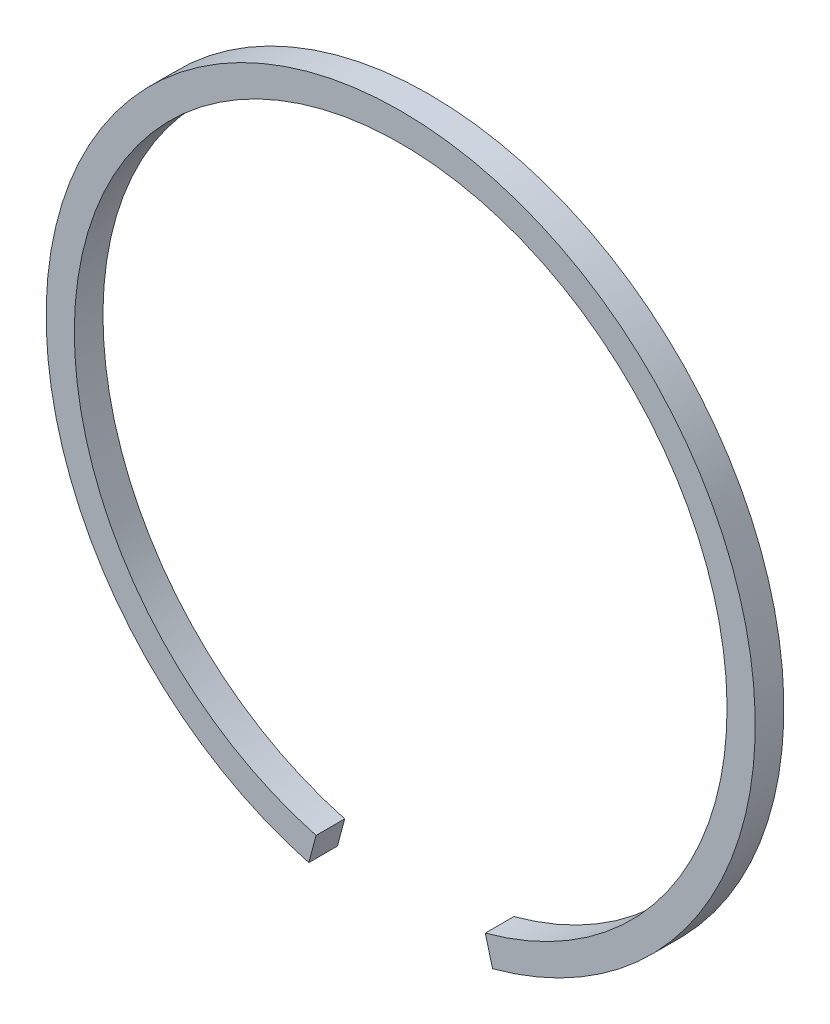
ISO-10303-21;
HEADER;
FILE_DESCRIPTION(('STEP AP214'),'2;1');
FILE_NAME('part.step','',(''),(''),'','','');
FILE_SCHEMA(('AUTOMOTIVE_DESIGN { 1 0 10303 214 1 1 1 1 }'));
ENDSEC;
DATA;
#1=APPLICATION_CONTEXT('core data for automotive mechanical design processes');
#2=APPLICATION_PROTOCOL_DEFINITION('international standard','automotive_design',2000,#1);
#3=PRODUCT_CONTEXT('',#1,'mechanical');
#4=PRODUCT('Part','Part','',(#3));
#5=PRODUCT_RELATED_PRODUCT_CATEGORY('part','',(#4));
#6=PRODUCT_DEFINITION_FORMATION('','',#4);
#7=PRODUCT_DEFINITION_CONTEXT('part definition',#1,'design');
#8=PRODUCT_DEFINITION('design','',#6,#7);
#9=PRODUCT_DEFINITION_SHAPE('','',#8);
#10=(LENGTH_UNIT() NAMED_UNIT(*) SI_UNIT(.MILLI.,.METRE.));
#11=(NAMED_UNIT(*) PLANE_ANGLE_UNIT() SI_UNIT($,.RADIAN.));
#12=(NAMED_UNIT(*) SI_UNIT($,.STERADIAN.) SOLID_ANGLE_UNIT());
#13=UNCERTAINTY_MEASURE_WITH_UNIT(LENGTH_MEASURE(1.E-05),#10,'distance_accuracy_value','');
#14=(GEOMETRIC_REPRESENTATION_CONTEXT(3) GLOBAL_UNCERTAINTY_ASSIGNED_CONTEXT((#13)) GLOBAL_UNIT_ASSIGNED_CONTEXT((#10,
#11,#12)) REPRESENTATION_CONTEXT('',''));
#15=CARTESIAN_POINT('',(0.,0.,0.));
#16=DIRECTION('',(0.,0.,1.));
#17=DIRECTION('',(1.,0.,0.));
#18=AXIS2_PLACEMENT_3D('',#15,#16,#17);
#19=CARTESIAN_POINT('',(0.,0.,0.));
#20=DIRECTION('',(0.,0.,-1.));
#21=DIRECTION('',(0.,-1.,0.));
#22=AXIS2_PLACEMENT_3D('',#19,#20,#21);
#23=PLANE('',#22);
#24=DIRECTION('',(-0.259179265658748,-0.965829233484156,0.));
#25=VECTOR('',#24,1.);
#26=CARTESIAN_POINT('',(-6.,-22.3589467551582,0.));
#27=LINE('',#26,#25);
#28=CARTESIAN_POINT('',(-6.,-22.3589467551582,0.));
#29=VERTEX_POINT('',#28);
#30=CARTESIAN_POINT('',(-6.51835853131747,-24.2906052221265,0.));
#31=VERTEX_POINT('',#30);
#32=EDGE_CURVE('E70',#29,#31,#27,.T.);
#33=ORIENTED_EDGE('',*,*,#32,.T.);
#34=CARTESIAN_POINT('',(0.,0.,0.));
#35=DIRECTION('',(0.,0.,-1.));
#36=DIRECTION('',(1.,0.,0.));
#37=AXIS2_PLACEMENT_3D('',#34,#35,#36);
#38=CIRCLE('',#37,25.15);
#39=CARTESIAN_POINT('',(6.51835853148648,-24.2906052220812,0.));
#40=VERTEX_POINT('',#39);
#41=EDGE_CURVE('E95',#31,#40,#38,.T.);
#42=ORIENTED_EDGE('',*,*,#41,.T.);
#43=DIRECTION('',(-0.259179265658747,0.965829233484156,0.));
#44=VECTOR('',#43,1.);
#45=CARTESIAN_POINT('',(6.51835853131749,-24.2906052221265,0.));
#46=LINE('',#45,#44);
#47=CARTESIAN_POINT('',(6.,-22.3589467551582,0.));
#48=VERTEX_POINT('',#47);
#49=EDGE_CURVE('E71',#40,#48,#46,.T.);
#50=ORIENTED_EDGE('',*,*,#49,.T.);
#51=CARTESIAN_POINT('',(0.,0.,0.));
#52=DIRECTION('',(0.,0.,1.));
#53=DIRECTION('',(1.,0.,0.));
#54=AXIS2_PLACEMENT_3D('',#51,#52,#53);
#55=CIRCLE('',#54,23.15);
#56=EDGE_CURVE('E24',#48,#29,#55,.T.);
#57=ORIENTED_EDGE('',*,*,#56,.T.);
#58=EDGE_LOOP('',(#33,#42,#50,#57));
#59=FACE_BOUND('',#58,.T.);
#60=ADVANCED_FACE('F16',(#59),#23,.T.);
#61=CARTESIAN_POINT('',(0.,0.,2.03));
#62=DIRECTION('',(0.,0.,-1.));
#63=DIRECTION('',(0.,-1.,0.));
#64=AXIS2_PLACEMENT_3D('',#61,#62,#63);
#65=PLANE('',#64);
#66=DIRECTION('',(-0.259179265658748,-0.965829233484156,0.));
#67=VECTOR('',#66,1.);
#68=CARTESIAN_POINT('',(-6.,-22.3589467551582,2.03));
#69=LINE('',#68,#67);
#70=CARTESIAN_POINT('',(-6.,-22.3589467551582,2.03));
#71=VERTEX_POINT('',#70);
#72=CARTESIAN_POINT('',(-6.51835853131747,-24.2906052221265,2.03));
#73=VERTEX_POINT('',#72);
#74=EDGE_CURVE('E81',#71,#73,#69,.T.);
#75=ORIENTED_EDGE('',*,*,#74,.F.);
#76=CARTESIAN_POINT('',(0.,0.,2.03));
#77=DIRECTION('',(0.,0.,1.));
#78=DIRECTION('',(1.,0.,0.));
#79=AXIS2_PLACEMENT_3D('',#76,#77,#78);
#80=CIRCLE('',#79,23.15);
#81=CARTESIAN_POINT('',(6.,-22.3589467551582,2.03));
#82=VERTEX_POINT('',#81);
#83=EDGE_CURVE('E11',#82,#71,#80,.T.);
#84=ORIENTED_EDGE('',*,*,#83,.F.);
#85=DIRECTION('',(-0.259179265658747,0.965829233484156,0.));
#86=VECTOR('',#85,1.);
#87=CARTESIAN_POINT('',(6.51835853131749,-24.2906052221265,2.03));
#88=LINE('',#87,#86);
#89=CARTESIAN_POINT('',(6.51835853148648,-24.2906052220812,2.03));
#90=VERTEX_POINT('',#89);
#91=EDGE_CURVE('E101',#90,#82,#88,.T.);
#92=ORIENTED_EDGE('',*,*,#91,.F.);
#93=CARTESIAN_POINT('',(0.,0.,2.03));
#94=DIRECTION('',(0.,0.,-1.));
#95=DIRECTION('',(1.,0.,0.));
#96=AXIS2_PLACEMENT_3D('',#93,#94,#95);
#97=CIRCLE('',#96,25.15);
#98=EDGE_CURVE('E98',#73,#90,#97,.T.);
#99=ORIENTED_EDGE('',*,*,#98,.F.);
#100=EDGE_LOOP('',(#75,#84,#92,#99));
#101=FACE_BOUND('',#100,.T.);
#102=ADVANCED_FACE('F116',(#101),#65,.F.);
#103=CARTESIAN_POINT('',(0.,0.,2.03));
#104=DIRECTION('',(0.,0.,-1.));
#105=DIRECTION('',(-1.,0.,0.));
#106=AXIS2_PLACEMENT_3D('',#103,#104,#105);
#107=CYLINDRICAL_SURFACE('',#106,23.15);
#108=ORIENTED_EDGE('',*,*,#56,.F.);
#109=DIRECTION('',(0.,0.,-1.));
#110=VECTOR('',#109,1.);
#111=CARTESIAN_POINT('',(6.,-22.3589467551582,2.03));
#112=LINE('',#111,#110);
#113=EDGE_CURVE('E73',#82,#48,#112,.T.);
#114=ORIENTED_EDGE('',*,*,#113,.F.);
#115=ORIENTED_EDGE('',*,*,#83,.T.);
#116=DIRECTION('',(0.,0.,-1.));
#117=VECTOR('',#116,1.);
#118=CARTESIAN_POINT('',(-6.,-22.3589467551582,2.03));
#119=LINE('',#118,#117);
#120=EDGE_CURVE('E76',#71,#29,#119,.T.);
#121=ORIENTED_EDGE('',*,*,#120,.T.);
#122=EDGE_LOOP('',(#108,#114,#115,#121));
#123=FACE_BOUND('',#122,.T.);
#124=ADVANCED_FACE('F77',(#123),#107,.F.);
#125=CARTESIAN_POINT('',(6.51835853131749,-24.2906052221265,2.03));
#126=DIRECTION('',(-0.965829233484156,-0.259179265658747,0.));
#127=DIRECTION('',(-0.259179265658747,0.965829233484156,0.));
#128=AXIS2_PLACEMENT_3D('',#125,#126,#127);
#129=PLANE('',#128);
#130=ORIENTED_EDGE('',*,*,#49,.F.);
#131=DIRECTION('',(0.,0.,-1.));
#132=VECTOR('',#131,1.);
#133=CARTESIAN_POINT('',(6.51835853148648,-24.2906052220812,2.03));
#134=LINE('',#133,#132);
#135=EDGE_CURVE('E104',#90,#40,#134,.T.);
#136=ORIENTED_EDGE('',*,*,#135,.F.);
#137=ORIENTED_EDGE('',*,*,#91,.T.);
#138=ORIENTED_EDGE('',*,*,#113,.T.);
#139=EDGE_LOOP('',(#130,#136,#137,#138));
#140=FACE_BOUND('',#139,.T.);
#141=ADVANCED_FACE('F115',(#140),#129,.T.);
#142=CARTESIAN_POINT('',(0.,0.,2.03));
#143=DIRECTION('',(0.,0.,-1.));
#144=DIRECTION('',(-1.,0.,0.));
#145=AXIS2_PLACEMENT_3D('',#142,#143,#144);
#146=CYLINDRICAL_SURFACE('',#145,25.15);
#147=ORIENTED_EDGE('',*,*,#41,.F.);
#148=DIRECTION('',(0.,0.,-1.));
#149=VECTOR('',#148,1.);
#150=CARTESIAN_POINT('',(-6.51835853131747,-24.2906052221265,2.03));
#151=LINE('',#150,#149);
#152=EDGE_CURVE('E86',#73,#31,#151,.T.);
#153=ORIENTED_EDGE('',*,*,#152,.F.);
#154=ORIENTED_EDGE('',*,*,#98,.T.);
#155=ORIENTED_EDGE('',*,*,#135,.T.);
#156=EDGE_LOOP('',(#147,#153,#154,#155));
#157=FACE_BOUND('',#156,.T.);
#158=ADVANCED_FACE('F118',(#157),#146,.T.);
#159=CARTESIAN_POINT('',(-6.,-22.3589467551582,2.03));
#160=DIRECTION('',(0.965829233484156,-0.259179265658748,0.));
#161=DIRECTION('',(0.,0.,-1.));
#162=AXIS2_PLACEMENT_3D('',#159,#160,#161);
#163=PLANE('',#162);
#164=ORIENTED_EDGE('',*,*,#32,.F.);
#165=ORIENTED_EDGE('',*,*,#120,.F.);
#166=ORIENTED_EDGE('',*,*,#74,.T.);
#167=ORIENTED_EDGE('',*,*,#152,.T.);
#168=EDGE_LOOP('',(#164,#165,#166,#167));
#169=FACE_BOUND('',#168,.T.);
#170=ADVANCED_FACE('F84',(#169),#163,.T.);
#171=CLOSED_SHELL('',(#60,#102,#124,#141,#158,#170));
#172=MANIFOLD_SOLID_BREP('B1',#171);
#173=ADVANCED_BREP_SHAPE_REPRESENTATION('',(#18,#172),#14);
#174=SHAPE_DEFINITION_REPRESENTATION(#9,#173);
ENDSEC;
END-ISO-10303-21;
